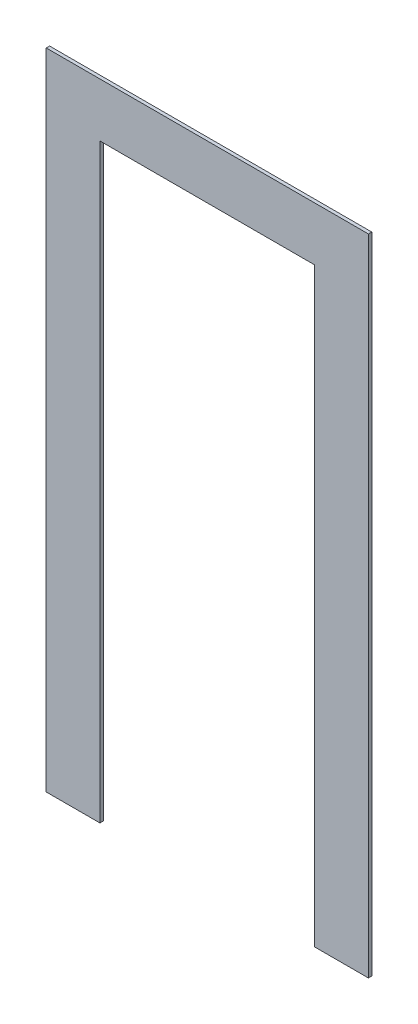
ISO-10303-21;
HEADER;
FILE_DESCRIPTION(('STEP AP214'),'2;1');
FILE_NAME('part.step','',(''),(''),'','','');
FILE_SCHEMA(('AUTOMOTIVE_DESIGN { 1 0 10303 214 1 1 1 1 }'));
ENDSEC;
DATA;
#1=APPLICATION_CONTEXT('core data for automotive mechanical design processes');
#2=APPLICATION_PROTOCOL_DEFINITION('international standard','automotive_design',2000,#1);
#3=PRODUCT_CONTEXT('',#1,'mechanical');
#4=PRODUCT('Part','Part','',(#3));
#5=PRODUCT_RELATED_PRODUCT_CATEGORY('part','',(#4));
#6=PRODUCT_DEFINITION_FORMATION('','',#4);
#7=PRODUCT_DEFINITION_CONTEXT('part definition',#1,'design');
#8=PRODUCT_DEFINITION('design','',#6,#7);
#9=PRODUCT_DEFINITION_SHAPE('','',#8);
#10=(LENGTH_UNIT() NAMED_UNIT(*) SI_UNIT(.MILLI.,.METRE.));
#11=(NAMED_UNIT(*) PLANE_ANGLE_UNIT() SI_UNIT($,.RADIAN.));
#12=(NAMED_UNIT(*) SI_UNIT($,.STERADIAN.) SOLID_ANGLE_UNIT());
#13=UNCERTAINTY_MEASURE_WITH_UNIT(LENGTH_MEASURE(1.E-05),#10,'distance_accuracy_value','');
#14=(GEOMETRIC_REPRESENTATION_CONTEXT(3) GLOBAL_UNCERTAINTY_ASSIGNED_CONTEXT((#13)) GLOBAL_UNIT_ASSIGNED_CONTEXT((#10,
#11,#12)) REPRESENTATION_CONTEXT('',''));
#15=CARTESIAN_POINT('',(0.,0.,0.));
#16=DIRECTION('',(0.,0.,1.));
#17=DIRECTION('',(1.,0.,0.));
#18=AXIS2_PLACEMENT_3D('',#15,#16,#17);
#19=CARTESIAN_POINT('',(0.,0.,3.175));
#20=DIRECTION('',(0.,1.,0.));
#21=DIRECTION('',(0.,0.,1.));
#22=AXIS2_PLACEMENT_3D('',#19,#20,#21);
#23=PLANE('',#22);
#24=DIRECTION('',(1.,0.,0.));
#25=VECTOR('',#24,1.);
#26=CARTESIAN_POINT('',(0.,0.,3.175));
#27=LINE('',#26,#25);
#28=CARTESIAN_POINT('',(254.,0.,3.175));
#29=VERTEX_POINT('',#28);
#30=CARTESIAN_POINT('',(304.8,0.,3.175));
#31=VERTEX_POINT('',#30);
#32=EDGE_CURVE('E136',#29,#31,#27,.T.);
#33=ORIENTED_EDGE('',*,*,#32,.F.);
#34=DIRECTION('',(0.,0.,1.));
#35=VECTOR('',#34,1.);
#36=CARTESIAN_POINT('',(254.,0.,-594.598755464557));
#37=LINE('',#36,#35);
#38=CARTESIAN_POINT('',(254.,0.,0.));
#39=VERTEX_POINT('',#38);
#40=EDGE_CURVE('E123',#39,#29,#37,.T.);
#41=ORIENTED_EDGE('',*,*,#40,.F.);
#42=DIRECTION('',(1.,0.,0.));
#43=VECTOR('',#42,1.);
#44=CARTESIAN_POINT('',(0.,0.,0.));
#45=LINE('',#44,#43);
#46=CARTESIAN_POINT('',(304.8,0.,0.));
#47=VERTEX_POINT('',#46);
#48=EDGE_CURVE('E134',#39,#47,#45,.T.);
#49=ORIENTED_EDGE('',*,*,#48,.T.);
#50=DIRECTION('',(0.,0.,-1.));
#51=VECTOR('',#50,1.);
#52=CARTESIAN_POINT('',(304.8,0.,3.175));
#53=LINE('',#52,#51);
#54=EDGE_CURVE('E53',#31,#47,#53,.T.);
#55=ORIENTED_EDGE('',*,*,#54,.F.);
#56=EDGE_LOOP('',(#33,#41,#49,#55));
#57=FACE_BOUND('',#56,.T.);
#58=ADVANCED_FACE('F44',(#57),#23,.F.);
#59=CARTESIAN_POINT('',(0.,0.,3.175));
#60=DIRECTION('',(1.,0.,0.));
#61=DIRECTION('',(0.,0.,-1.));
#62=AXIS2_PLACEMENT_3D('',#59,#60,#61);
#63=PLANE('',#62);
#64=DIRECTION('',(0.,-1.,0.));
#65=VECTOR('',#64,1.);
#66=CARTESIAN_POINT('',(0.,0.,0.));
#67=LINE('',#66,#65);
#68=CARTESIAN_POINT('',(0.,609.6,0.));
#69=VERTEX_POINT('',#68);
#70=CARTESIAN_POINT('',(0.,0.,0.));
#71=VERTEX_POINT('',#70);
#72=EDGE_CURVE('E145',#69,#71,#67,.T.);
#73=ORIENTED_EDGE('',*,*,#72,.T.);
#74=DIRECTION('',(0.,0.,-1.));
#75=VECTOR('',#74,1.);
#76=CARTESIAN_POINT('',(0.,0.,3.175));
#77=LINE('',#76,#75);
#78=CARTESIAN_POINT('',(0.,0.,3.175));
#79=VERTEX_POINT('',#78);
#80=EDGE_CURVE('E11',#79,#71,#77,.T.);
#81=ORIENTED_EDGE('',*,*,#80,.F.);
#82=DIRECTION('',(0.,-1.,0.));
#83=VECTOR('',#82,1.);
#84=CARTESIAN_POINT('',(0.,0.,3.175));
#85=LINE('',#84,#83);
#86=CARTESIAN_POINT('',(0.,609.6,3.175));
#87=VERTEX_POINT('',#86);
#88=EDGE_CURVE('E158',#87,#79,#85,.T.);
#89=ORIENTED_EDGE('',*,*,#88,.F.);
#90=DIRECTION('',(0.,0.,-1.));
#91=VECTOR('',#90,1.);
#92=CARTESIAN_POINT('',(0.,609.6,3.175));
#93=LINE('',#92,#91);
#94=EDGE_CURVE('E159',#87,#69,#93,.T.);
#95=ORIENTED_EDGE('',*,*,#94,.T.);
#96=EDGE_LOOP('',(#73,#81,#89,#95));
#97=FACE_BOUND('',#96,.T.);
#98=ADVANCED_FACE('F46',(#97),#63,.F.);
#99=CARTESIAN_POINT('',(50.8,0.,0.));
#100=VERTEX_POINT('',#99);
#101=EDGE_CURVE('E144',#71,#100,#45,.T.);
#102=ORIENTED_EDGE('',*,*,#101,.T.);
#103=DIRECTION('',(0.,0.,1.));
#104=VECTOR('',#103,1.);
#105=CARTESIAN_POINT('',(50.8,0.,-594.598755464557));
#106=LINE('',#105,#104);
#107=CARTESIAN_POINT('',(50.8,0.,3.175));
#108=VERTEX_POINT('',#107);
#109=EDGE_CURVE('E60',#100,#108,#106,.T.);
#110=ORIENTED_EDGE('',*,*,#109,.T.);
#111=EDGE_CURVE('E96',#79,#108,#27,.T.);
#112=ORIENTED_EDGE('',*,*,#111,.F.);
#113=ORIENTED_EDGE('',*,*,#80,.T.);
#114=EDGE_LOOP('',(#102,#110,#112,#113));
#115=FACE_BOUND('',#114,.T.);
#116=ADVANCED_FACE('F206',(#115),#23,.F.);
#117=CARTESIAN_POINT('',(304.8,0.,3.175));
#118=DIRECTION('',(-1.,0.,0.));
#119=DIRECTION('',(0.,0.,1.));
#120=AXIS2_PLACEMENT_3D('',#117,#118,#119);
#121=PLANE('',#120);
#122=DIRECTION('',(0.,1.,0.));
#123=VECTOR('',#122,1.);
#124=CARTESIAN_POINT('',(304.8,0.,0.));
#125=LINE('',#124,#123);
#126=CARTESIAN_POINT('',(304.8,609.6,0.));
#127=VERTEX_POINT('',#126);
#128=EDGE_CURVE('E142',#47,#127,#125,.T.);
#129=ORIENTED_EDGE('',*,*,#128,.T.);
#130=DIRECTION('',(0.,0.,-1.));
#131=VECTOR('',#130,1.);
#132=CARTESIAN_POINT('',(304.8,609.6,3.175));
#133=LINE('',#132,#131);
#134=CARTESIAN_POINT('',(304.8,609.6,3.175));
#135=VERTEX_POINT('',#134);
#136=EDGE_CURVE('E162',#135,#127,#133,.T.);
#137=ORIENTED_EDGE('',*,*,#136,.F.);
#138=DIRECTION('',(0.,1.,0.));
#139=VECTOR('',#138,1.);
#140=CARTESIAN_POINT('',(304.8,0.,3.175));
#141=LINE('',#140,#139);
#142=EDGE_CURVE('E169',#31,#135,#141,.T.);
#143=ORIENTED_EDGE('',*,*,#142,.F.);
#144=ORIENTED_EDGE('',*,*,#54,.T.);
#145=EDGE_LOOP('',(#129,#137,#143,#144));
#146=FACE_BOUND('',#145,.T.);
#147=ADVANCED_FACE('F167',(#146),#121,.F.);
#148=CARTESIAN_POINT('',(0.,609.6,3.175));
#149=DIRECTION('',(0.,-1.,0.));
#150=DIRECTION('',(0.,0.,-1.));
#151=AXIS2_PLACEMENT_3D('',#148,#149,#150);
#152=PLANE('',#151);
#153=DIRECTION('',(-1.,0.,0.));
#154=VECTOR('',#153,1.);
#155=CARTESIAN_POINT('',(0.,609.6,0.));
#156=LINE('',#155,#154);
#157=EDGE_CURVE('E90',#127,#69,#156,.T.);
#158=ORIENTED_EDGE('',*,*,#157,.T.);
#159=ORIENTED_EDGE('',*,*,#94,.F.);
#160=DIRECTION('',(-1.,0.,0.));
#161=VECTOR('',#160,1.);
#162=CARTESIAN_POINT('',(0.,609.6,3.175));
#163=LINE('',#162,#161);
#164=EDGE_CURVE('E69',#135,#87,#163,.T.);
#165=ORIENTED_EDGE('',*,*,#164,.F.);
#166=ORIENTED_EDGE('',*,*,#136,.T.);
#167=EDGE_LOOP('',(#158,#159,#165,#166));
#168=FACE_BOUND('',#167,.T.);
#169=ADVANCED_FACE('F211',(#168),#152,.F.);
#170=CARTESIAN_POINT('',(0.,0.,3.175));
#171=DIRECTION('',(0.,0.,-1.));
#172=DIRECTION('',(-1.,0.,0.));
#173=AXIS2_PLACEMENT_3D('',#170,#171,#172);
#174=PLANE('',#173);
#175=DIRECTION('',(-1.,0.,0.));
#176=VECTOR('',#175,1.);
#177=CARTESIAN_POINT('',(50.8,558.8,3.175));
#178=LINE('',#177,#176);
#179=CARTESIAN_POINT('',(254.,558.8,3.175));
#180=VERTEX_POINT('',#179);
#181=CARTESIAN_POINT('',(50.8,558.8,3.175));
#182=VERTEX_POINT('',#181);
#183=EDGE_CURVE('E138',#180,#182,#178,.T.);
#184=ORIENTED_EDGE('',*,*,#183,.F.);
#185=DIRECTION('',(0.,1.,0.));
#186=VECTOR('',#185,1.);
#187=CARTESIAN_POINT('',(254.,0.,3.175));
#188=LINE('',#187,#186);
#189=EDGE_CURVE('E194',#29,#180,#188,.T.);
#190=ORIENTED_EDGE('',*,*,#189,.F.);
#191=ORIENTED_EDGE('',*,*,#32,.T.);
#192=ORIENTED_EDGE('',*,*,#142,.T.);
#193=ORIENTED_EDGE('',*,*,#164,.T.);
#194=ORIENTED_EDGE('',*,*,#88,.T.);
#195=ORIENTED_EDGE('',*,*,#111,.T.);
#196=DIRECTION('',(0.,-1.,0.));
#197=VECTOR('',#196,1.);
#198=CARTESIAN_POINT('',(50.8,0.,3.175));
#199=LINE('',#198,#197);
#200=EDGE_CURVE('E191',#182,#108,#199,.T.);
#201=ORIENTED_EDGE('',*,*,#200,.F.);
#202=EDGE_LOOP('',(#184,#190,#191,#192,#193,#194,#195,#201));
#203=FACE_BOUND('',#202,.T.);
#204=ADVANCED_FACE('F204',(#203),#174,.F.);
#205=CARTESIAN_POINT('',(0.,0.,0.));
#206=DIRECTION('',(0.,0.,-1.));
#207=DIRECTION('',(-1.,0.,0.));
#208=AXIS2_PLACEMENT_3D('',#205,#206,#207);
#209=PLANE('',#208);
#210=DIRECTION('',(0.,1.,0.));
#211=VECTOR('',#210,1.);
#212=CARTESIAN_POINT('',(254.,0.,0.));
#213=LINE('',#212,#211);
#214=CARTESIAN_POINT('',(254.,558.8,0.));
#215=VERTEX_POINT('',#214);
#216=EDGE_CURVE('E119',#39,#215,#213,.T.);
#217=ORIENTED_EDGE('',*,*,#216,.T.);
#218=DIRECTION('',(-1.,0.,0.));
#219=VECTOR('',#218,1.);
#220=CARTESIAN_POINT('',(50.8,558.8,0.));
#221=LINE('',#220,#219);
#222=CARTESIAN_POINT('',(50.8,558.8,0.));
#223=VERTEX_POINT('',#222);
#224=EDGE_CURVE('E183',#215,#223,#221,.T.);
#225=ORIENTED_EDGE('',*,*,#224,.T.);
#226=DIRECTION('',(0.,-1.,0.));
#227=VECTOR('',#226,1.);
#228=CARTESIAN_POINT('',(50.8,0.,0.));
#229=LINE('',#228,#227);
#230=EDGE_CURVE('E179',#223,#100,#229,.T.);
#231=ORIENTED_EDGE('',*,*,#230,.T.);
#232=ORIENTED_EDGE('',*,*,#101,.F.);
#233=ORIENTED_EDGE('',*,*,#72,.F.);
#234=ORIENTED_EDGE('',*,*,#157,.F.);
#235=ORIENTED_EDGE('',*,*,#128,.F.);
#236=ORIENTED_EDGE('',*,*,#48,.F.);
#237=EDGE_LOOP('',(#217,#225,#231,#232,#233,#234,#235,#236));
#238=FACE_BOUND('',#237,.T.);
#239=ADVANCED_FACE('F141',(#238),#209,.T.);
#240=CARTESIAN_POINT('',(254.,0.,-594.598755464557));
#241=DIRECTION('',(1.,0.,0.));
#242=DIRECTION('',(0.,0.,-1.));
#243=AXIS2_PLACEMENT_3D('',#240,#241,#242);
#244=PLANE('',#243);
#245=ORIENTED_EDGE('',*,*,#40,.T.);
#246=ORIENTED_EDGE('',*,*,#189,.T.);
#247=DIRECTION('',(0.,0.,1.));
#248=VECTOR('',#247,1.);
#249=CARTESIAN_POINT('',(254.,558.8,-594.598755464557));
#250=LINE('',#249,#248);
#251=EDGE_CURVE('E125',#215,#180,#250,.T.);
#252=ORIENTED_EDGE('',*,*,#251,.F.);
#253=ORIENTED_EDGE('',*,*,#216,.F.);
#254=EDGE_LOOP('',(#245,#246,#252,#253));
#255=FACE_BOUND('',#254,.T.);
#256=ADVANCED_FACE('F121',(#255),#244,.F.);
#257=CARTESIAN_POINT('',(50.8,558.8,-594.598755464557));
#258=DIRECTION('',(0.,1.,0.));
#259=DIRECTION('',(0.,0.,1.));
#260=AXIS2_PLACEMENT_3D('',#257,#258,#259);
#261=PLANE('',#260);
#262=ORIENTED_EDGE('',*,*,#251,.T.);
#263=ORIENTED_EDGE('',*,*,#183,.T.);
#264=DIRECTION('',(0.,0.,1.));
#265=VECTOR('',#264,1.);
#266=CARTESIAN_POINT('',(50.8,558.8,-594.598755464557));
#267=LINE('',#266,#265);
#268=EDGE_CURVE('E184',#223,#182,#267,.T.);
#269=ORIENTED_EDGE('',*,*,#268,.F.);
#270=ORIENTED_EDGE('',*,*,#224,.F.);
#271=EDGE_LOOP('',(#262,#263,#269,#270));
#272=FACE_BOUND('',#271,.T.);
#273=ADVANCED_FACE('F203',(#272),#261,.F.);
#274=CARTESIAN_POINT('',(50.8,0.,-594.598755464557));
#275=DIRECTION('',(-1.,0.,0.));
#276=DIRECTION('',(0.,0.,1.));
#277=AXIS2_PLACEMENT_3D('',#274,#275,#276);
#278=PLANE('',#277);
#279=ORIENTED_EDGE('',*,*,#268,.T.);
#280=ORIENTED_EDGE('',*,*,#200,.T.);
#281=ORIENTED_EDGE('',*,*,#109,.F.);
#282=ORIENTED_EDGE('',*,*,#230,.F.);
#283=EDGE_LOOP('',(#279,#280,#281,#282));
#284=FACE_BOUND('',#283,.T.);
#285=ADVANCED_FACE('F205',(#284),#278,.F.);
#286=CLOSED_SHELL('',(#58,#98,#116,#147,#169,#204,#239,#256,#273,#285));
#287=MANIFOLD_SOLID_BREP('B2',#286);
#288=ADVANCED_BREP_SHAPE_REPRESENTATION('',(#18,#287),#14);
#289=SHAPE_DEFINITION_REPRESENTATION(#9,#288);
ENDSEC;
END-ISO-10303-21;
